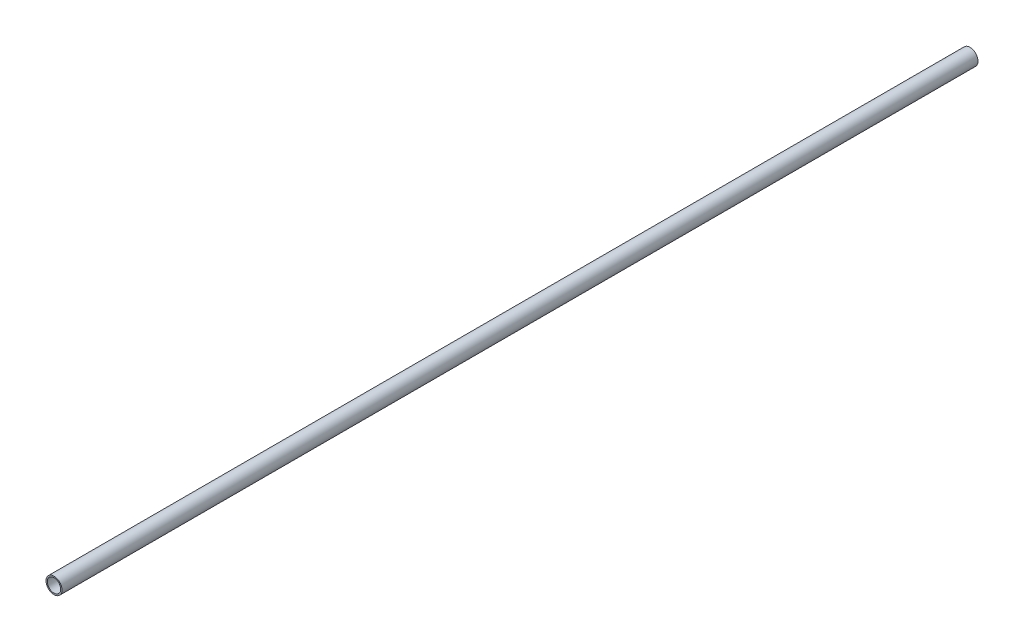
ISO-10303-21;
HEADER;
FILE_DESCRIPTION(('STEP AP214'),'2;1');
FILE_NAME('part.step','',(''),(''),'','','');
FILE_SCHEMA(('AUTOMOTIVE_DESIGN { 1 0 10303 214 1 1 1 1 }'));
ENDSEC;
DATA;
#1=APPLICATION_CONTEXT('core data for automotive mechanical design processes');
#2=APPLICATION_PROTOCOL_DEFINITION('international standard','automotive_design',2000,#1);
#3=PRODUCT_CONTEXT('',#1,'mechanical');
#4=PRODUCT('Part','Part','',(#3));
#5=PRODUCT_RELATED_PRODUCT_CATEGORY('part','',(#4));
#6=PRODUCT_DEFINITION_FORMATION('','',#4);
#7=PRODUCT_DEFINITION_CONTEXT('part definition',#1,'design');
#8=PRODUCT_DEFINITION('design','',#6,#7);
#9=PRODUCT_DEFINITION_SHAPE('','',#8);
#10=(LENGTH_UNIT() NAMED_UNIT(*) SI_UNIT(.MILLI.,.METRE.));
#11=(NAMED_UNIT(*) PLANE_ANGLE_UNIT() SI_UNIT($,.RADIAN.));
#12=(NAMED_UNIT(*) SI_UNIT($,.STERADIAN.) SOLID_ANGLE_UNIT());
#13=UNCERTAINTY_MEASURE_WITH_UNIT(LENGTH_MEASURE(1.E-05),#10,'distance_accuracy_value','');
#14=(GEOMETRIC_REPRESENTATION_CONTEXT(3) GLOBAL_UNCERTAINTY_ASSIGNED_CONTEXT((#13)) GLOBAL_UNIT_ASSIGNED_CONTEXT((#10,
#11,#12)) REPRESENTATION_CONTEXT('',''));
#15=CARTESIAN_POINT('',(0.,0.,0.));
#16=DIRECTION('',(0.,0.,1.));
#17=DIRECTION('',(1.,0.,0.));
#18=AXIS2_PLACEMENT_3D('',#15,#16,#17);
#19=CARTESIAN_POINT('',(0.,0.,685.));
#20=DIRECTION('',(0.,0.,1.));
#21=DIRECTION('',(1.,0.,0.));
#22=AXIS2_PLACEMENT_3D('',#19,#20,#21);
#23=PLANE('',#22);
#24=CARTESIAN_POINT('',(0.,0.,685.));
#25=DIRECTION('',(0.,0.,1.));
#26=DIRECTION('',(1.,0.,0.));
#27=AXIS2_PLACEMENT_3D('',#24,#25,#26);
#28=CIRCLE('',#27,6.);
#29=CARTESIAN_POINT('',(6.,0.,685.));
#30=VERTEX_POINT('',#29);
#31=EDGE_CURVE('E13',#30,#30,#28,.T.);
#32=ORIENTED_EDGE('',*,*,#31,.T.);
#33=EDGE_LOOP('',(#32));
#34=FACE_BOUND('',#33,.T.);
#35=CARTESIAN_POINT('',(0.,0.,685.));
#36=DIRECTION('',(0.,0.,1.));
#37=DIRECTION('',(1.,0.,0.));
#38=AXIS2_PLACEMENT_3D('',#35,#36,#37);
#39=CIRCLE('',#38,5.);
#40=CARTESIAN_POINT('',(5.,0.,685.));
#41=VERTEX_POINT('',#40);
#42=EDGE_CURVE('E60',#41,#41,#39,.T.);
#43=ORIENTED_EDGE('',*,*,#42,.F.);
#44=EDGE_LOOP('',(#43));
#45=FACE_BOUND('',#44,.T.);
#46=ADVANCED_FACE('F49',(#34,#45),#23,.T.);
#47=CARTESIAN_POINT('',(0.,0.,0.));
#48=DIRECTION('',(0.,0.,1.));
#49=DIRECTION('',(1.,0.,0.));
#50=AXIS2_PLACEMENT_3D('',#47,#48,#49);
#51=PLANE('',#50);
#52=CARTESIAN_POINT('',(0.,0.,0.));
#53=DIRECTION('',(0.,0.,1.));
#54=DIRECTION('',(1.,0.,0.));
#55=AXIS2_PLACEMENT_3D('',#52,#53,#54);
#56=CIRCLE('',#55,6.);
#57=CARTESIAN_POINT('',(6.,0.,0.));
#58=VERTEX_POINT('',#57);
#59=EDGE_CURVE('E53',#58,#58,#56,.T.);
#60=ORIENTED_EDGE('',*,*,#59,.F.);
#61=EDGE_LOOP('',(#60));
#62=FACE_BOUND('',#61,.T.);
#63=CARTESIAN_POINT('',(0.,0.,0.));
#64=DIRECTION('',(0.,0.,1.));
#65=DIRECTION('',(1.,0.,0.));
#66=AXIS2_PLACEMENT_3D('',#63,#64,#65);
#67=CIRCLE('',#66,5.);
#68=CARTESIAN_POINT('',(5.,0.,0.));
#69=VERTEX_POINT('',#68);
#70=EDGE_CURVE('E62',#69,#69,#67,.T.);
#71=ORIENTED_EDGE('',*,*,#70,.T.);
#72=EDGE_LOOP('',(#71));
#73=FACE_BOUND('',#72,.T.);
#74=ADVANCED_FACE('F72',(#62,#73),#51,.F.);
#75=CARTESIAN_POINT('',(0.,0.,685.));
#76=DIRECTION('',(0.,0.,-1.));
#77=DIRECTION('',(-1.,0.,0.));
#78=AXIS2_PLACEMENT_3D('',#75,#76,#77);
#79=CYLINDRICAL_SURFACE('',#78,6.);
#80=ORIENTED_EDGE('',*,*,#31,.F.);
#81=EDGE_LOOP('',(#80));
#82=FACE_BOUND('',#81,.T.);
#83=ORIENTED_EDGE('',*,*,#59,.T.);
#84=EDGE_LOOP('',(#83));
#85=FACE_BOUND('',#84,.T.);
#86=ADVANCED_FACE('F51',(#82,#85),#79,.T.);
#87=CARTESIAN_POINT('',(0.,0.,685.));
#88=DIRECTION('',(0.,0.,-1.));
#89=DIRECTION('',(-1.,0.,0.));
#90=AXIS2_PLACEMENT_3D('',#87,#88,#89);
#91=CYLINDRICAL_SURFACE('',#90,5.);
#92=ORIENTED_EDGE('',*,*,#42,.T.);
#93=EDGE_LOOP('',(#92));
#94=FACE_BOUND('',#93,.T.);
#95=ORIENTED_EDGE('',*,*,#70,.F.);
#96=EDGE_LOOP('',(#95));
#97=FACE_BOUND('',#96,.T.);
#98=ADVANCED_FACE('F68',(#94,#97),#91,.F.);
#99=CLOSED_SHELL('',(#46,#74,#86,#98));
#100=MANIFOLD_SOLID_BREP('B2',#99);
#101=ADVANCED_BREP_SHAPE_REPRESENTATION('',(#18,#100),#14);
#102=SHAPE_DEFINITION_REPRESENTATION(#9,#101);
ENDSEC;
END-ISO-10303-21;
